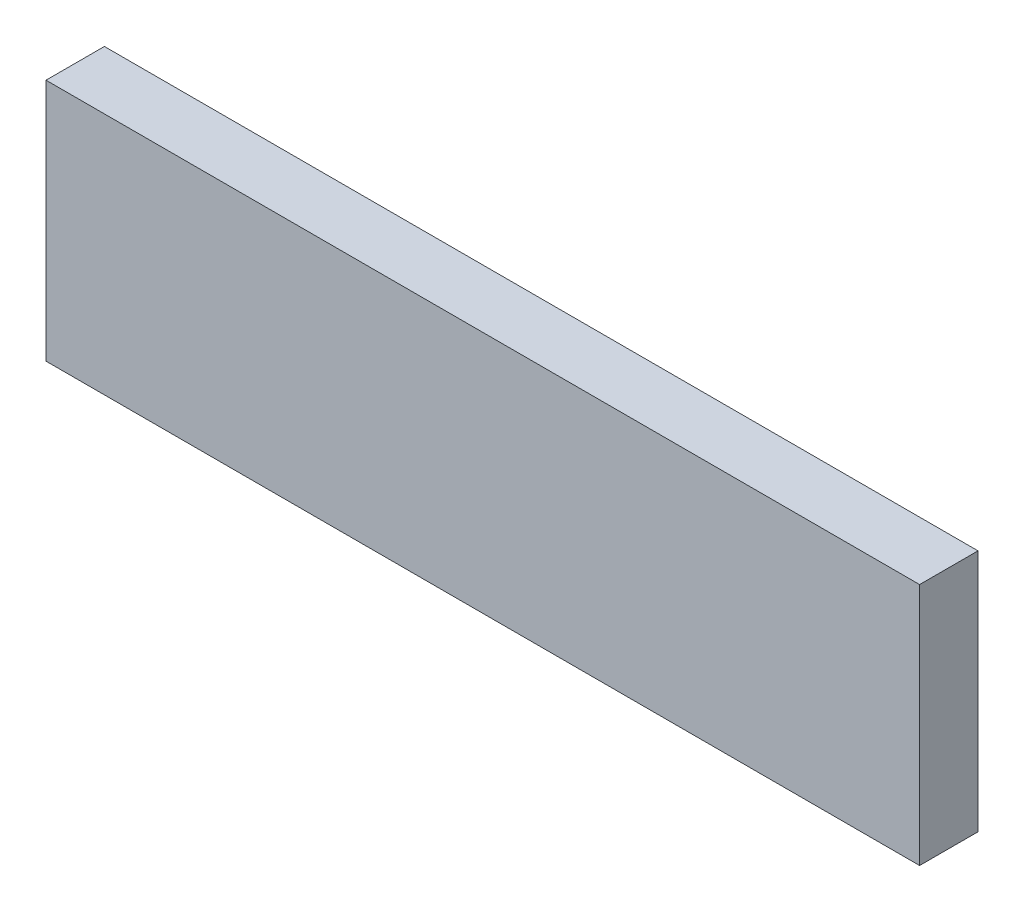
ISO-10303-21;
HEADER;
FILE_DESCRIPTION(('STEP AP214'),'2;1');
FILE_NAME('part.step','',(''),(''),'','','');
FILE_SCHEMA(('AUTOMOTIVE_DESIGN { 1 0 10303 214 1 1 1 1 }'));
ENDSEC;
DATA;
#1=APPLICATION_CONTEXT('core data for automotive mechanical design processes');
#2=APPLICATION_PROTOCOL_DEFINITION('international standard','automotive_design',2000,#1);
#3=PRODUCT_CONTEXT('',#1,'mechanical');
#4=PRODUCT('Part','Part','',(#3));
#5=PRODUCT_RELATED_PRODUCT_CATEGORY('part','',(#4));
#6=PRODUCT_DEFINITION_FORMATION('','',#4);
#7=PRODUCT_DEFINITION_CONTEXT('part definition',#1,'design');
#8=PRODUCT_DEFINITION('design','',#6,#7);
#9=PRODUCT_DEFINITION_SHAPE('','',#8);
#10=(LENGTH_UNIT() NAMED_UNIT(*) SI_UNIT(.MILLI.,.METRE.));
#11=(NAMED_UNIT(*) PLANE_ANGLE_UNIT() SI_UNIT($,.RADIAN.));
#12=(NAMED_UNIT(*) SI_UNIT($,.STERADIAN.) SOLID_ANGLE_UNIT());
#13=UNCERTAINTY_MEASURE_WITH_UNIT(LENGTH_MEASURE(1.E-05),#10,'distance_accuracy_value','');
#14=(GEOMETRIC_REPRESENTATION_CONTEXT(3) GLOBAL_UNCERTAINTY_ASSIGNED_CONTEXT((#13)) GLOBAL_UNIT_ASSIGNED_CONTEXT((#10,
#11,#12)) REPRESENTATION_CONTEXT('',''));
#15=CARTESIAN_POINT('',(0.,0.,0.));
#16=DIRECTION('',(0.,0.,1.));
#17=DIRECTION('',(1.,0.,0.));
#18=AXIS2_PLACEMENT_3D('',#15,#16,#17);
#19=CARTESIAN_POINT('',(89.75,25.,6.));
#20=DIRECTION('',(-1.,0.,0.));
#21=DIRECTION('',(0.,0.,1.));
#22=AXIS2_PLACEMENT_3D('',#19,#20,#21);
#23=PLANE('',#22);
#24=DIRECTION('',(0.,1.,0.));
#25=VECTOR('',#24,1.);
#26=CARTESIAN_POINT('',(89.75,25.,-6.));
#27=LINE('',#26,#25);
#28=CARTESIAN_POINT('',(89.75,-25.,-6.));
#29=VERTEX_POINT('',#28);
#30=CARTESIAN_POINT('',(89.75,25.,-6.));
#31=VERTEX_POINT('',#30);
#32=EDGE_CURVE('E102',#29,#31,#27,.T.);
#33=ORIENTED_EDGE('',*,*,#32,.T.);
#34=DIRECTION('',(0.,0.,-1.));
#35=VECTOR('',#34,1.);
#36=CARTESIAN_POINT('',(89.75,25.,6.));
#37=LINE('',#36,#35);
#38=CARTESIAN_POINT('',(89.75,25.,6.));
#39=VERTEX_POINT('',#38);
#40=EDGE_CURVE('E11',#39,#31,#37,.T.);
#41=ORIENTED_EDGE('',*,*,#40,.F.);
#42=DIRECTION('',(0.,1.,0.));
#43=VECTOR('',#42,1.);
#44=CARTESIAN_POINT('',(89.75,25.,6.));
#45=LINE('',#44,#43);
#46=CARTESIAN_POINT('',(89.75,-25.,6.));
#47=VERTEX_POINT('',#46);
#48=EDGE_CURVE('E89',#47,#39,#45,.T.);
#49=ORIENTED_EDGE('',*,*,#48,.F.);
#50=DIRECTION('',(0.,0.,-1.));
#51=VECTOR('',#50,1.);
#52=CARTESIAN_POINT('',(89.75,-25.,6.));
#53=LINE('',#52,#51);
#54=EDGE_CURVE('E98',#47,#29,#53,.T.);
#55=ORIENTED_EDGE('',*,*,#54,.T.);
#56=EDGE_LOOP('',(#33,#41,#49,#55));
#57=FACE_BOUND('',#56,.T.);
#58=ADVANCED_FACE('F36',(#57),#23,.F.);
#59=CARTESIAN_POINT('',(-89.75,25.,6.));
#60=DIRECTION('',(0.,-1.,0.));
#61=DIRECTION('',(1.,0.,0.));
#62=AXIS2_PLACEMENT_3D('',#59,#60,#61);
#63=PLANE('',#62);
#64=DIRECTION('',(-1.,0.,0.));
#65=VECTOR('',#64,1.);
#66=CARTESIAN_POINT('',(-89.75,25.,-6.));
#67=LINE('',#66,#65);
#68=CARTESIAN_POINT('',(-89.75,25.,-6.));
#69=VERTEX_POINT('',#68);
#70=EDGE_CURVE('E93',#31,#69,#67,.T.);
#71=ORIENTED_EDGE('',*,*,#70,.T.);
#72=DIRECTION('',(0.,0.,-1.));
#73=VECTOR('',#72,1.);
#74=CARTESIAN_POINT('',(-89.75,25.,6.));
#75=LINE('',#74,#73);
#76=CARTESIAN_POINT('',(-89.75,25.,6.));
#77=VERTEX_POINT('',#76);
#78=EDGE_CURVE('E45',#77,#69,#75,.T.);
#79=ORIENTED_EDGE('',*,*,#78,.F.);
#80=DIRECTION('',(-1.,0.,0.));
#81=VECTOR('',#80,1.);
#82=CARTESIAN_POINT('',(-89.75,25.,6.));
#83=LINE('',#82,#81);
#84=EDGE_CURVE('E84',#39,#77,#83,.T.);
#85=ORIENTED_EDGE('',*,*,#84,.F.);
#86=ORIENTED_EDGE('',*,*,#40,.T.);
#87=EDGE_LOOP('',(#71,#79,#85,#86));
#88=FACE_BOUND('',#87,.T.);
#89=ADVANCED_FACE('F92',(#88),#63,.F.);
#90=CARTESIAN_POINT('',(-89.75,25.,6.));
#91=DIRECTION('',(1.,0.,0.));
#92=DIRECTION('',(0.,0.,-1.));
#93=AXIS2_PLACEMENT_3D('',#90,#91,#92);
#94=PLANE('',#93);
#95=DIRECTION('',(0.,-1.,0.));
#96=VECTOR('',#95,1.);
#97=CARTESIAN_POINT('',(-89.75,25.,-6.));
#98=LINE('',#97,#96);
#99=CARTESIAN_POINT('',(-89.75,-25.,-6.));
#100=VERTEX_POINT('',#99);
#101=EDGE_CURVE('E71',#69,#100,#98,.T.);
#102=ORIENTED_EDGE('',*,*,#101,.T.);
#103=DIRECTION('',(0.,0.,-1.));
#104=VECTOR('',#103,1.);
#105=CARTESIAN_POINT('',(-89.75,-25.,6.));
#106=LINE('',#105,#104);
#107=CARTESIAN_POINT('',(-89.75,-25.,6.));
#108=VERTEX_POINT('',#107);
#109=EDGE_CURVE('E94',#108,#100,#106,.T.);
#110=ORIENTED_EDGE('',*,*,#109,.F.);
#111=DIRECTION('',(0.,-1.,0.));
#112=VECTOR('',#111,1.);
#113=CARTESIAN_POINT('',(-89.75,25.,6.));
#114=LINE('',#113,#112);
#115=EDGE_CURVE('E87',#77,#108,#114,.T.);
#116=ORIENTED_EDGE('',*,*,#115,.F.);
#117=ORIENTED_EDGE('',*,*,#78,.T.);
#118=EDGE_LOOP('',(#102,#110,#116,#117));
#119=FACE_BOUND('',#118,.T.);
#120=ADVANCED_FACE('F96',(#119),#94,.F.);
#121=CARTESIAN_POINT('',(-89.75,-25.,6.));
#122=DIRECTION('',(0.,1.,0.));
#123=DIRECTION('',(0.,0.,1.));
#124=AXIS2_PLACEMENT_3D('',#121,#122,#123);
#125=PLANE('',#124);
#126=CARTESIAN_POINT('',(83.7499999999999,-25.,0.));
#127=DIRECTION('',(0.,1.,0.));
#128=DIRECTION('',(0.,0.,1.));
#129=AXIS2_PLACEMENT_3D('',#126,#127,#128);
#130=CIRCLE('',#129,1.50000000000001);
#131=CARTESIAN_POINT('',(83.7499999999999,-25.,1.50000000000001));
#132=VERTEX_POINT('',#131);
#133=EDGE_CURVE('E39',#132,#132,#130,.T.);
#134=ORIENTED_EDGE('',*,*,#133,.T.);
#135=EDGE_LOOP('',(#134));
#136=FACE_BOUND('',#135,.T.);
#137=CARTESIAN_POINT('',(-71.25,-25.,0.));
#138=DIRECTION('',(0.,1.,0.));
#139=DIRECTION('',(0.,0.,1.));
#140=AXIS2_PLACEMENT_3D('',#137,#138,#139);
#141=CIRCLE('',#140,1.50000000000001);
#142=CARTESIAN_POINT('',(-71.25,-25.,1.50000000000001));
#143=VERTEX_POINT('',#142);
#144=EDGE_CURVE('E105',#143,#143,#141,.T.);
#145=ORIENTED_EDGE('',*,*,#144,.T.);
#146=EDGE_LOOP('',(#145));
#147=FACE_BOUND('',#146,.T.);
#148=DIRECTION('',(1.,0.,0.));
#149=VECTOR('',#148,1.);
#150=CARTESIAN_POINT('',(-89.75,-25.,-6.));
#151=LINE('',#150,#149);
#152=EDGE_CURVE('E77',#100,#29,#151,.T.);
#153=ORIENTED_EDGE('',*,*,#152,.T.);
#154=ORIENTED_EDGE('',*,*,#54,.F.);
#155=DIRECTION('',(1.,0.,0.));
#156=VECTOR('',#155,1.);
#157=CARTESIAN_POINT('',(-89.75,-25.,6.));
#158=LINE('',#157,#156);
#159=EDGE_CURVE('E54',#108,#47,#158,.T.);
#160=ORIENTED_EDGE('',*,*,#159,.F.);
#161=ORIENTED_EDGE('',*,*,#109,.T.);
#162=EDGE_LOOP('',(#153,#154,#160,#161));
#163=FACE_BOUND('',#162,.T.);
#164=ADVANCED_FACE('F133',(#136,#147,#163),#125,.F.);
#165=CARTESIAN_POINT('',(0.,0.,6.));
#166=DIRECTION('',(0.,0.,1.));
#167=DIRECTION('',(1.,0.,0.));
#168=AXIS2_PLACEMENT_3D('',#165,#166,#167);
#169=PLANE('',#168);
#170=ORIENTED_EDGE('',*,*,#48,.T.);
#171=ORIENTED_EDGE('',*,*,#84,.T.);
#172=ORIENTED_EDGE('',*,*,#115,.T.);
#173=ORIENTED_EDGE('',*,*,#159,.T.);
#174=EDGE_LOOP('',(#170,#171,#172,#173));
#175=FACE_BOUND('',#174,.T.);
#176=ADVANCED_FACE('F85',(#175),#169,.T.);
#177=CARTESIAN_POINT('',(0.,0.,-6.));
#178=DIRECTION('',(0.,0.,1.));
#179=DIRECTION('',(1.,0.,0.));
#180=AXIS2_PLACEMENT_3D('',#177,#178,#179);
#181=PLANE('',#180);
#182=ORIENTED_EDGE('',*,*,#32,.F.);
#183=ORIENTED_EDGE('',*,*,#152,.F.);
#184=ORIENTED_EDGE('',*,*,#101,.F.);
#185=ORIENTED_EDGE('',*,*,#70,.F.);
#186=EDGE_LOOP('',(#182,#183,#184,#185));
#187=FACE_BOUND('',#186,.T.);
#188=ADVANCED_FACE('F140',(#187),#181,.F.);
#189=CARTESIAN_POINT('',(-71.25,-10.,0.));
#190=DIRECTION('',(0.,-1.,0.));
#191=DIRECTION('',(0.,0.,-1.));
#192=AXIS2_PLACEMENT_3D('',#189,#190,#191);
#193=CYLINDRICAL_SURFACE('',#192,1.50000000000001);
#194=CARTESIAN_POINT('',(-71.25,-10.,0.));
#195=DIRECTION('',(0.,-1.,0.));
#196=DIRECTION('',(0.,0.,-1.));
#197=AXIS2_PLACEMENT_3D('',#194,#195,#196);
#198=CIRCLE('',#197,1.50000000000001);
#199=CARTESIAN_POINT('',(-71.25,-10.,-1.50000000000001));
#200=VERTEX_POINT('',#199);
#201=EDGE_CURVE('E111',#200,#200,#198,.T.);
#202=ORIENTED_EDGE('',*,*,#201,.F.);
#203=EDGE_LOOP('',(#202));
#204=FACE_BOUND('',#203,.T.);
#205=ORIENTED_EDGE('',*,*,#144,.F.);
#206=EDGE_LOOP('',(#205));
#207=FACE_BOUND('',#206,.T.);
#208=ADVANCED_FACE('F152',(#204,#207),#193,.F.);
#209=CARTESIAN_POINT('',(-71.25,-10.,0.));
#210=DIRECTION('',(0.,-1.,0.));
#211=DIRECTION('',(0.,0.,-1.));
#212=AXIS2_PLACEMENT_3D('',#209,#210,#211);
#213=PLANE('',#212);
#214=ORIENTED_EDGE('',*,*,#201,.T.);
#215=EDGE_LOOP('',(#214));
#216=FACE_BOUND('',#215,.T.);
#217=ADVANCED_FACE('F129',(#216),#213,.T.);
#218=CARTESIAN_POINT('',(83.7499999999999,-10.,0.));
#219=DIRECTION('',(0.,-1.,0.));
#220=DIRECTION('',(0.,0.,-1.));
#221=AXIS2_PLACEMENT_3D('',#218,#219,#220);
#222=CYLINDRICAL_SURFACE('',#221,1.50000000000001);
#223=CARTESIAN_POINT('',(83.7499999999999,-10.,0.));
#224=DIRECTION('',(0.,-1.,0.));
#225=DIRECTION('',(0.,0.,-1.));
#226=AXIS2_PLACEMENT_3D('',#223,#224,#225);
#227=CIRCLE('',#226,1.50000000000001);
#228=CARTESIAN_POINT('',(83.7499999999999,-10.,-1.50000000000001));
#229=VERTEX_POINT('',#228);
#230=EDGE_CURVE('E119',#229,#229,#227,.T.);
#231=ORIENTED_EDGE('',*,*,#230,.F.);
#232=EDGE_LOOP('',(#231));
#233=FACE_BOUND('',#232,.T.);
#234=ORIENTED_EDGE('',*,*,#133,.F.);
#235=EDGE_LOOP('',(#234));
#236=FACE_BOUND('',#235,.T.);
#237=ADVANCED_FACE('F126',(#233,#236),#222,.F.);
#238=CARTESIAN_POINT('',(83.7499999999999,-10.,0.));
#239=DIRECTION('',(0.,-1.,0.));
#240=DIRECTION('',(0.,0.,-1.));
#241=AXIS2_PLACEMENT_3D('',#238,#239,#240);
#242=PLANE('',#241);
#243=ORIENTED_EDGE('',*,*,#230,.T.);
#244=EDGE_LOOP('',(#243));
#245=FACE_BOUND('',#244,.T.);
#246=ADVANCED_FACE('F124',(#245),#242,.T.);
#247=CLOSED_SHELL('',(#58,#89,#120,#164,#176,#188,#208,#217,#237,#246));
#248=MANIFOLD_SOLID_BREP('B2',#247);
#249=ADVANCED_BREP_SHAPE_REPRESENTATION('',(#18,#248),#14);
#250=SHAPE_DEFINITION_REPRESENTATION(#9,#249);
ENDSEC;
END-ISO-10303-21;
